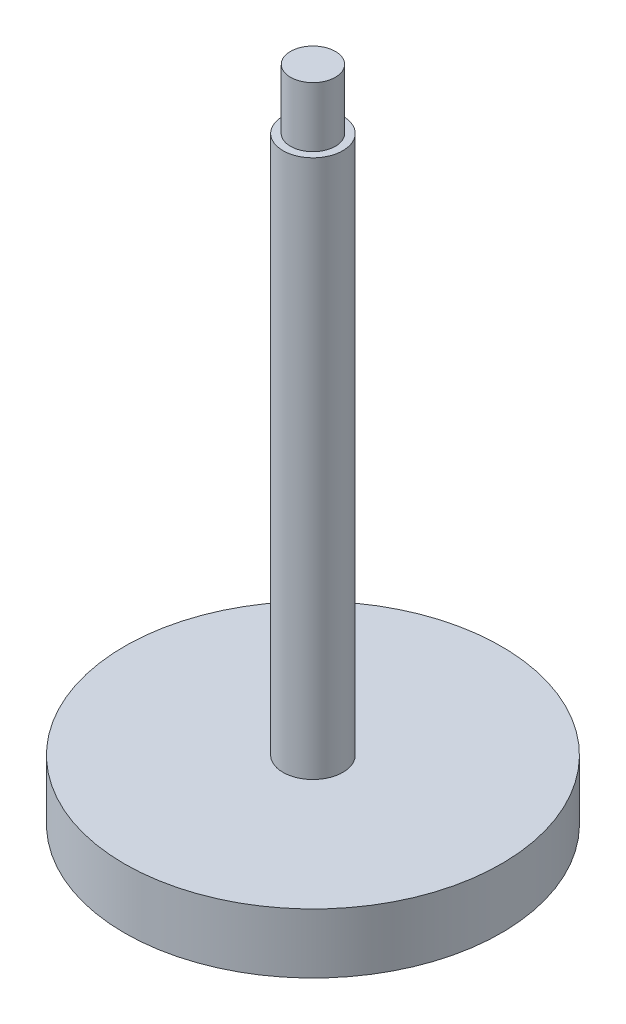
ISO-10303-21;
HEADER;
FILE_DESCRIPTION(('STEP AP214'),'2;1');
FILE_NAME('part.step','',(''),(''),'','','');
FILE_SCHEMA(('AUTOMOTIVE_DESIGN { 1 0 10303 214 1 1 1 1 }'));
ENDSEC;
DATA;
#1=APPLICATION_CONTEXT('core data for automotive mechanical design processes');
#2=APPLICATION_PROTOCOL_DEFINITION('international standard','automotive_design',2000,#1);
#3=PRODUCT_CONTEXT('',#1,'mechanical');
#4=PRODUCT('Part','Part','',(#3));
#5=PRODUCT_RELATED_PRODUCT_CATEGORY('part','',(#4));
#6=PRODUCT_DEFINITION_FORMATION('','',#4);
#7=PRODUCT_DEFINITION_CONTEXT('part definition',#1,'design');
#8=PRODUCT_DEFINITION('design','',#6,#7);
#9=PRODUCT_DEFINITION_SHAPE('','',#8);
#10=(LENGTH_UNIT() NAMED_UNIT(*) SI_UNIT(.MILLI.,.METRE.));
#11=(NAMED_UNIT(*) PLANE_ANGLE_UNIT() SI_UNIT($,.RADIAN.));
#12=(NAMED_UNIT(*) SI_UNIT($,.STERADIAN.) SOLID_ANGLE_UNIT());
#13=UNCERTAINTY_MEASURE_WITH_UNIT(LENGTH_MEASURE(1.E-05),#10,'distance_accuracy_value','');
#14=(GEOMETRIC_REPRESENTATION_CONTEXT(3) GLOBAL_UNCERTAINTY_ASSIGNED_CONTEXT((#13)) GLOBAL_UNIT_ASSIGNED_CONTEXT((#10,
#11,#12)) REPRESENTATION_CONTEXT('',''));
#15=CARTESIAN_POINT('',(0.,0.,0.));
#16=DIRECTION('',(0.,0.,1.));
#17=DIRECTION('',(1.,0.,0.));
#18=AXIS2_PLACEMENT_3D('',#15,#16,#17);
#19=CARTESIAN_POINT('',(0.,220.,0.));
#20=DIRECTION('',(0.,-1.,0.));
#21=DIRECTION('',(0.,0.,-1.));
#22=AXIS2_PLACEMENT_3D('',#19,#20,#21);
#23=CYLINDRICAL_SURFACE('',#22,10.);
#24=CARTESIAN_POINT('',(0.,20.,0.));
#25=DIRECTION('',(0.,1.,0.));
#26=DIRECTION('',(0.,0.,1.));
#27=AXIS2_PLACEMENT_3D('',#24,#25,#26);
#28=CIRCLE('',#27,10.);
#29=CARTESIAN_POINT('',(0.,20.,10.));
#30=VERTEX_POINT('',#29);
#31=EDGE_CURVE('E11',#30,#30,#28,.T.);
#32=ORIENTED_EDGE('',*,*,#31,.T.);
#33=EDGE_LOOP('',(#32));
#34=FACE_BOUND('',#33,.T.);
#35=CARTESIAN_POINT('',(0.,200.,0.));
#36=DIRECTION('',(0.,1.,0.));
#37=DIRECTION('',(0.,0.,1.));
#38=AXIS2_PLACEMENT_3D('',#35,#36,#37);
#39=CIRCLE('',#38,10.);
#40=CARTESIAN_POINT('',(0.,200.,10.));
#41=VERTEX_POINT('',#40);
#42=EDGE_CURVE('E42',#41,#41,#39,.T.);
#43=ORIENTED_EDGE('',*,*,#42,.F.);
#44=EDGE_LOOP('',(#43));
#45=FACE_BOUND('',#44,.T.);
#46=ADVANCED_FACE('F38',(#34,#45),#23,.T.);
#47=CARTESIAN_POINT('',(0.,20.,0.));
#48=DIRECTION('',(0.,-1.,0.));
#49=DIRECTION('',(0.,0.,-1.));
#50=AXIS2_PLACEMENT_3D('',#47,#48,#49);
#51=CYLINDRICAL_SURFACE('',#50,63.);
#52=CARTESIAN_POINT('',(0.,20.,0.));
#53=DIRECTION('',(0.,1.,0.));
#54=DIRECTION('',(0.,0.,1.));
#55=AXIS2_PLACEMENT_3D('',#52,#53,#54);
#56=CIRCLE('',#55,63.);
#57=CARTESIAN_POINT('',(0.,20.,63.));
#58=VERTEX_POINT('',#57);
#59=EDGE_CURVE('E47',#58,#58,#56,.T.);
#60=ORIENTED_EDGE('',*,*,#59,.F.);
#61=EDGE_LOOP('',(#60));
#62=FACE_BOUND('',#61,.T.);
#63=CARTESIAN_POINT('',(0.,0.,0.));
#64=DIRECTION('',(0.,1.,0.));
#65=DIRECTION('',(0.,0.,1.));
#66=AXIS2_PLACEMENT_3D('',#63,#64,#65);
#67=CIRCLE('',#66,63.);
#68=CARTESIAN_POINT('',(0.,0.,63.));
#69=VERTEX_POINT('',#68);
#70=EDGE_CURVE('E53',#69,#69,#67,.T.);
#71=ORIENTED_EDGE('',*,*,#70,.T.);
#72=EDGE_LOOP('',(#71));
#73=FACE_BOUND('',#72,.T.);
#74=ADVANCED_FACE('F40',(#62,#73),#51,.T.);
#75=CARTESIAN_POINT('',(0.,20.,0.));
#76=DIRECTION('',(0.,1.,0.));
#77=DIRECTION('',(0.,0.,1.));
#78=AXIS2_PLACEMENT_3D('',#75,#76,#77);
#79=PLANE('',#78);
#80=ORIENTED_EDGE('',*,*,#31,.F.);
#81=EDGE_LOOP('',(#80));
#82=FACE_BOUND('',#81,.T.);
#83=ORIENTED_EDGE('',*,*,#59,.T.);
#84=EDGE_LOOP('',(#83));
#85=FACE_BOUND('',#84,.T.);
#86=ADVANCED_FACE('F94',(#82,#85),#79,.T.);
#87=CARTESIAN_POINT('',(0.,0.,0.));
#88=DIRECTION('',(0.,1.,0.));
#89=DIRECTION('',(0.,0.,1.));
#90=AXIS2_PLACEMENT_3D('',#87,#88,#89);
#91=PLANE('',#90);
#92=ORIENTED_EDGE('',*,*,#70,.F.);
#93=EDGE_LOOP('',(#92));
#94=FACE_BOUND('',#93,.T.);
#95=ADVANCED_FACE('F86',(#94),#91,.F.);
#96=CARTESIAN_POINT('',(0.,200.,0.));
#97=DIRECTION('',(0.,1.,0.));
#98=DIRECTION('',(0.,0.,1.));
#99=AXIS2_PLACEMENT_3D('',#96,#97,#98);
#100=PLANE('',#99);
#101=CARTESIAN_POINT('',(0.,200.,0.));
#102=DIRECTION('',(0.,1.,0.));
#103=DIRECTION('',(0.,0.,1.));
#104=AXIS2_PLACEMENT_3D('',#101,#102,#103);
#105=CIRCLE('',#104,7.5);
#106=CARTESIAN_POINT('',(0.,200.,7.5));
#107=VERTEX_POINT('',#106);
#108=EDGE_CURVE('E64',#107,#107,#105,.T.);
#109=ORIENTED_EDGE('',*,*,#108,.F.);
#110=EDGE_LOOP('',(#109));
#111=FACE_BOUND('',#110,.T.);
#112=ORIENTED_EDGE('',*,*,#42,.T.);
#113=EDGE_LOOP('',(#112));
#114=FACE_BOUND('',#113,.T.);
#115=ADVANCED_FACE('F79',(#111,#114),#100,.T.);
#116=CARTESIAN_POINT('',(0.,200.,0.));
#117=DIRECTION('',(0.,1.,0.));
#118=DIRECTION('',(0.,0.,1.));
#119=AXIS2_PLACEMENT_3D('',#116,#117,#118);
#120=CYLINDRICAL_SURFACE('',#119,7.5);
#121=ORIENTED_EDGE('',*,*,#108,.T.);
#122=EDGE_LOOP('',(#121));
#123=FACE_BOUND('',#122,.T.);
#124=CARTESIAN_POINT('',(0.,220.,0.));
#125=DIRECTION('',(0.,1.,0.));
#126=DIRECTION('',(0.,0.,1.));
#127=AXIS2_PLACEMENT_3D('',#124,#125,#126);
#128=CIRCLE('',#127,7.5);
#129=CARTESIAN_POINT('',(0.,220.,7.5));
#130=VERTEX_POINT('',#129);
#131=EDGE_CURVE('E56',#130,#130,#128,.T.);
#132=ORIENTED_EDGE('',*,*,#131,.F.);
#133=EDGE_LOOP('',(#132));
#134=FACE_BOUND('',#133,.T.);
#135=ADVANCED_FACE('F77',(#123,#134),#120,.T.);
#136=CARTESIAN_POINT('',(0.,220.,0.));
#137=DIRECTION('',(0.,1.,0.));
#138=DIRECTION('',(0.,0.,1.));
#139=AXIS2_PLACEMENT_3D('',#136,#137,#138);
#140=PLANE('',#139);
#141=ORIENTED_EDGE('',*,*,#131,.T.);
#142=EDGE_LOOP('',(#141));
#143=FACE_BOUND('',#142,.T.);
#144=ADVANCED_FACE('F75',(#143),#140,.T.);
#145=CLOSED_SHELL('',(#46,#74,#86,#95,#115,#135,#144));
#146=MANIFOLD_SOLID_BREP('B2',#145);
#147=ADVANCED_BREP_SHAPE_REPRESENTATION('',(#18,#146),#14);
#148=SHAPE_DEFINITION_REPRESENTATION(#9,#147);
ENDSEC;
END-ISO-10303-21;
